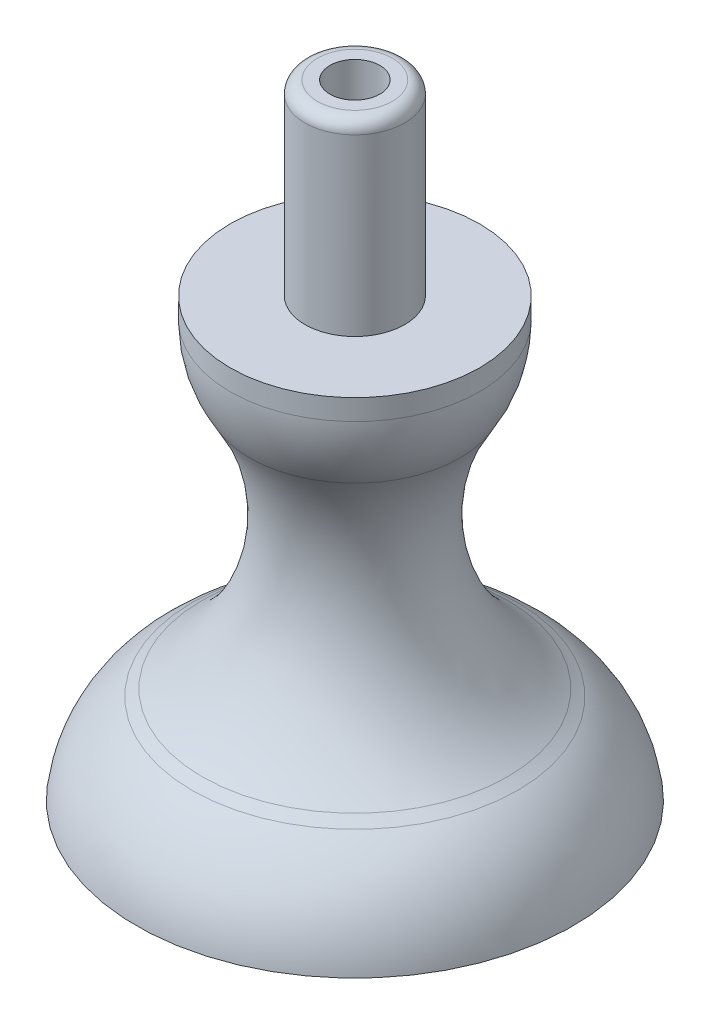
ISO-10303-21;
HEADER;
FILE_DESCRIPTION(('STEP AP214'),'2;1');
FILE_NAME('part.step','',(''),(''),'','','');
FILE_SCHEMA(('AUTOMOTIVE_DESIGN { 1 0 10303 214 1 1 1 1 }'));
ENDSEC;
DATA;
#1=APPLICATION_CONTEXT('core data for automotive mechanical design processes');
#2=APPLICATION_PROTOCOL_DEFINITION('international standard','automotive_design',2000,#1);
#3=PRODUCT_CONTEXT('',#1,'mechanical');
#4=PRODUCT('Part','Part','',(#3));
#5=PRODUCT_RELATED_PRODUCT_CATEGORY('part','',(#4));
#6=PRODUCT_DEFINITION_FORMATION('','',#4);
#7=PRODUCT_DEFINITION_CONTEXT('part definition',#1,'design');
#8=PRODUCT_DEFINITION('design','',#6,#7);
#9=PRODUCT_DEFINITION_SHAPE('','',#8);
#10=(LENGTH_UNIT() NAMED_UNIT(*) SI_UNIT(.MILLI.,.METRE.));
#11=(NAMED_UNIT(*) PLANE_ANGLE_UNIT() SI_UNIT($,.RADIAN.));
#12=(NAMED_UNIT(*) SI_UNIT($,.STERADIAN.) SOLID_ANGLE_UNIT());
#13=UNCERTAINTY_MEASURE_WITH_UNIT(LENGTH_MEASURE(1.E-05),#10,'distance_accuracy_value','');
#14=(GEOMETRIC_REPRESENTATION_CONTEXT(3) GLOBAL_UNCERTAINTY_ASSIGNED_CONTEXT((#13)) GLOBAL_UNIT_ASSIGNED_CONTEXT((#10,
#11,#12)) REPRESENTATION_CONTEXT('',''));
#15=CARTESIAN_POINT('',(0.,0.,0.));
#16=DIRECTION('',(0.,0.,1.));
#17=DIRECTION('',(1.,0.,0.));
#18=AXIS2_PLACEMENT_3D('',#15,#16,#17);
#19=CARTESIAN_POINT('',(0.,0.,0.));
#20=DIRECTION('',(0.,1.,0.));
#21=DIRECTION('',(0.,0.,1.));
#22=AXIS2_PLACEMENT_3D('',#19,#20,#21);
#23=PLANE('',#22);
#24=CARTESIAN_POINT('',(0.,0.,0.));
#25=DIRECTION('',(0.,1.,0.));
#26=DIRECTION('',(0.,0.,1.));
#27=AXIS2_PLACEMENT_3D('',#24,#25,#26);
#28=CIRCLE('',#27,12.5);
#29=CARTESIAN_POINT('',(0.,0.,12.5));
#30=VERTEX_POINT('',#29);
#31=EDGE_CURVE('E213',#30,#30,#28,.T.);
#32=ORIENTED_EDGE('',*,*,#31,.T.);
#33=EDGE_LOOP('',(#32));
#34=FACE_BOUND('',#33,.T.);
#35=CARTESIAN_POINT('',(0.,0.,0.));
#36=DIRECTION('',(0.,-1.,0.));
#37=DIRECTION('',(0.,0.,-1.));
#38=AXIS2_PLACEMENT_3D('',#35,#36,#37);
#39=CIRCLE('',#38,17.5);
#40=CARTESIAN_POINT('',(0.,0.,-17.5));
#41=VERTEX_POINT('',#40);
#42=EDGE_CURVE('E189',#41,#41,#39,.T.);
#43=ORIENTED_EDGE('',*,*,#42,.T.);
#44=EDGE_LOOP('',(#43));
#45=FACE_BOUND('',#44,.T.);
#46=ADVANCED_FACE('F60',(#34,#45),#23,.F.);
#47=CARTESIAN_POINT('',(0.,23.9142803193777,0.));
#48=DIRECTION('',(0.,-1.,0.));
#49=DIRECTION('',(0.,0.,-1.));
#50=AXIS2_PLACEMENT_3D('',#47,#48,#49);
#51=TOROIDAL_SURFACE('',#50,24.,20.);
#52=CARTESIAN_POINT('',(0.,7.1800390678363,0.));
#53=DIRECTION('',(0.,1.,0.));
#54=DIRECTION('',(0.,0.,1.));
#55=AXIS2_PLACEMENT_3D('',#52,#53,#54);
#56=CIRCLE('',#55,13.0471387420816);
#57=CARTESIAN_POINT('',(0.,7.1800390678363,13.0471387420816));
#58=VERTEX_POINT('',#57);
#59=EDGE_CURVE('E201',#58,#58,#56,.T.);
#60=ORIENTED_EDGE('',*,*,#59,.T.);
#61=EDGE_LOOP('',(#60));
#62=FACE_BOUND('',#61,.T.);
#63=CARTESIAN_POINT('',(0.,7.73240678839423,0.));
#64=DIRECTION('',(0.,1.,0.));
#65=DIRECTION('',(0.,0.,1.));
#66=AXIS2_PLACEMENT_3D('',#63,#64,#65);
#67=CIRCLE('',#66,12.2464061229233);
#68=CARTESIAN_POINT('',(0.,7.73240678839423,12.2464061229233));
#69=VERTEX_POINT('',#68);
#70=EDGE_CURVE('E197',#69,#69,#67,.F.);
#71=ORIENTED_EDGE('',*,*,#70,.T.);
#72=EDGE_LOOP('',(#71));
#73=FACE_BOUND('',#72,.T.);
#74=ADVANCED_FACE('F262',(#62,#73),#51,.F.);
#75=CARTESIAN_POINT('',(0.,30.,0.));
#76=DIRECTION('',(0.,1.,0.));
#77=DIRECTION('',(0.,0.,1.));
#78=AXIS2_PLACEMENT_3D('',#75,#76,#77);
#79=CYLINDRICAL_SURFACE('',#78,10.);
#80=CARTESIAN_POINT('',(0.,33.3376255800348,0.));
#81=DIRECTION('',(0.,1.,0.));
#82=DIRECTION('',(0.,0.,1.));
#83=AXIS2_PLACEMENT_3D('',#80,#81,#82);
#84=CIRCLE('',#83,10.);
#85=CARTESIAN_POINT('',(0.,33.3376255800348,10.));
#86=VERTEX_POINT('',#85);
#87=EDGE_CURVE('E209',#86,#86,#84,.T.);
#88=ORIENTED_EDGE('',*,*,#87,.T.);
#89=EDGE_LOOP('',(#88));
#90=FACE_BOUND('',#89,.T.);
#91=CARTESIAN_POINT('',(0.,35.,0.));
#92=DIRECTION('',(0.,-1.,0.));
#93=DIRECTION('',(0.,0.,-1.));
#94=AXIS2_PLACEMENT_3D('',#91,#92,#93);
#95=CIRCLE('',#94,10.);
#96=CARTESIAN_POINT('',(0.,35.,-10.));
#97=VERTEX_POINT('',#96);
#98=EDGE_CURVE('E176',#97,#97,#95,.T.);
#99=ORIENTED_EDGE('',*,*,#98,.T.);
#100=EDGE_LOOP('',(#99));
#101=FACE_BOUND('',#100,.T.);
#102=ADVANCED_FACE('F269',(#90,#101),#79,.T.);
#103=CARTESIAN_POINT('',(0.,35.,0.));
#104=DIRECTION('',(0.,-1.,0.));
#105=DIRECTION('',(0.,0.,-1.));
#106=AXIS2_PLACEMENT_3D('',#103,#104,#105);
#107=PLANE('',#106);
#108=CARTESIAN_POINT('',(0.,35.,0.));
#109=DIRECTION('',(0.,-1.,0.));
#110=DIRECTION('',(0.,0.,-1.));
#111=AXIS2_PLACEMENT_3D('',#108,#109,#110);
#112=CIRCLE('',#111,4.);
#113=CARTESIAN_POINT('',(0.,35.,-4.));
#114=VERTEX_POINT('',#113);
#115=EDGE_CURVE('E193',#114,#114,#112,.T.);
#116=ORIENTED_EDGE('',*,*,#115,.T.);
#117=EDGE_LOOP('',(#116));
#118=FACE_BOUND('',#117,.T.);
#119=ORIENTED_EDGE('',*,*,#98,.F.);
#120=EDGE_LOOP('',(#119));
#121=FACE_BOUND('',#120,.T.);
#122=ADVANCED_FACE('F330',(#118,#121),#107,.F.);
#123=CARTESIAN_POINT('',(0.,50.,0.));
#124=DIRECTION('',(0.,1.,0.));
#125=DIRECTION('',(0.,0.,1.));
#126=AXIS2_PLACEMENT_3D('',#123,#124,#125);
#127=PLANE('',#126);
#128=CARTESIAN_POINT('',(0.,50.,0.));
#129=DIRECTION('',(0.,1.,0.));
#130=DIRECTION('',(0.,0.,1.));
#131=AXIS2_PLACEMENT_3D('',#128,#129,#130);
#132=CIRCLE('',#131,3.);
#133=CARTESIAN_POINT('',(0.,50.,3.));
#134=VERTEX_POINT('',#133);
#135=EDGE_CURVE('E69',#134,#134,#132,.T.);
#136=ORIENTED_EDGE('',*,*,#135,.T.);
#137=EDGE_LOOP('',(#136));
#138=FACE_BOUND('',#137,.T.);
#139=CARTESIAN_POINT('',(0.,50.,0.));
#140=DIRECTION('',(0.,1.,0.));
#141=DIRECTION('',(0.,0.,1.));
#142=AXIS2_PLACEMENT_3D('',#139,#140,#141);
#143=CIRCLE('',#142,2.);
#144=CARTESIAN_POINT('',(0.,50.,2.));
#145=VERTEX_POINT('',#144);
#146=EDGE_CURVE('E225',#145,#145,#143,.T.);
#147=ORIENTED_EDGE('',*,*,#146,.F.);
#148=EDGE_LOOP('',(#147));
#149=FACE_BOUND('',#148,.T.);
#150=ADVANCED_FACE('F248',(#138,#149),#127,.T.);
#151=CARTESIAN_POINT('',(0.,50.,0.));
#152=DIRECTION('',(0.,-1.,0.));
#153=DIRECTION('',(0.,0.,-1.));
#154=AXIS2_PLACEMENT_3D('',#151,#152,#153);
#155=CYLINDRICAL_SURFACE('',#154,4.);
#156=CARTESIAN_POINT('',(0.,49.,0.));
#157=DIRECTION('',(0.,1.,0.));
#158=DIRECTION('',(0.,0.,1.));
#159=AXIS2_PLACEMENT_3D('',#156,#157,#158);
#160=CIRCLE('',#159,4.);
#161=CARTESIAN_POINT('',(0.,49.,4.));
#162=VERTEX_POINT('',#161);
#163=EDGE_CURVE('E12',#162,#162,#160,.F.);
#164=ORIENTED_EDGE('',*,*,#163,.T.);
#165=EDGE_LOOP('',(#164));
#166=FACE_BOUND('',#165,.T.);
#167=ORIENTED_EDGE('',*,*,#115,.F.);
#168=EDGE_LOOP('',(#167));
#169=FACE_BOUND('',#168,.T.);
#170=ADVANCED_FACE('F337',(#166,#169),#155,.T.);
#171=CARTESIAN_POINT('',(0.,19.8688119366319,0.));
#172=DIRECTION('',(0.,-1.,0.));
#173=DIRECTION('',(0.,0.,-1.));
#174=AXIS2_PLACEMENT_3D('',#171,#172,#173);
#175=TOROIDAL_SURFACE('',#174,21.0616015307309,15.);
#176=CARTESIAN_POINT('',(0.,27.9501001226736,0.));
#177=DIRECTION('',(0.,-1.,0.));
#178=DIRECTION('',(0.,0.,-1.));
#179=AXIS2_PLACEMENT_3D('',#176,#177,#178);
#180=CIRCLE('',#179,8.42464061229235);
#181=CARTESIAN_POINT('',(0.,27.9501001226736,-8.42464061229235));
#182=VERTEX_POINT('',#181);
#183=EDGE_CURVE('E205',#182,#182,#180,.T.);
#184=ORIENTED_EDGE('',*,*,#183,.T.);
#185=EDGE_LOOP('',(#184));
#186=FACE_BOUND('',#185,.T.);
#187=ORIENTED_EDGE('',*,*,#70,.F.);
#188=EDGE_LOOP('',(#187));
#189=FACE_BOUND('',#188,.T.);
#190=ADVANCED_FACE('F341',(#186,#189),#175,.F.);
#191=CARTESIAN_POINT('',(0.,-1.18708155793441,0.));
#192=DIRECTION('',(0.,-1.,0.));
#193=DIRECTION('',(0.,0.,-1.));
#194=AXIS2_PLACEMENT_3D('',#191,#192,#193);
#195=DEGENERATE_TOROIDAL_SURFACE('',#194,7.57070811312248,10.,.T.);
#196=ORIENTED_EDGE('',*,*,#59,.F.);
#197=EDGE_LOOP('',(#196));
#198=FACE_BOUND('',#197,.T.);
#199=ORIENTED_EDGE('',*,*,#42,.F.);
#200=EDGE_LOOP('',(#199));
#201=FACE_BOUND('',#200,.T.);
#202=ADVANCED_FACE('F346',(#198,#201),#195,.T.);
#203=CARTESIAN_POINT('',(0.,33.3376255800348,0.));
#204=DIRECTION('',(0.,0.,1.));
#205=DIRECTION('',(1.,0.,0.));
#206=AXIS2_PLACEMENT_3D('',#203,#204,#205);
#207=SPHERICAL_SURFACE('',#206,10.);
#208=CARTESIAN_POINT('',(0.,33.3376255800348,0.));
#209=DIRECTION('',(0.,1.,0.));
#210=DIRECTION('',(0.,0.,1.));
#211=AXIS2_PLACEMENT_3D('',#208,#209,#210);
#212=SPHERICAL_SURFACE('',#211,10.);
#213=ORIENTED_EDGE('',*,*,#87,.F.);
#214=EDGE_LOOP('',(#213));
#215=FACE_BOUND('',#214,.T.);
#216=ORIENTED_EDGE('',*,*,#183,.F.);
#217=EDGE_LOOP('',(#216));
#218=FACE_BOUND('',#217,.T.);
#219=ADVANCED_FACE('F328',(#215,#218),#212,.T.);
#220=CARTESIAN_POINT('',(0.,5.,0.));
#221=DIRECTION('',(0.,-1.,0.));
#222=DIRECTION('',(0.,0.,-1.));
#223=AXIS2_PLACEMENT_3D('',#220,#221,#222);
#224=CYLINDRICAL_SURFACE('',#223,6.25);
#225=CARTESIAN_POINT('',(0.,1.,0.));
#226=DIRECTION('',(0.,1.,0.));
#227=DIRECTION('',(0.,0.,1.));
#228=AXIS2_PLACEMENT_3D('',#225,#226,#227);
#229=CIRCLE('',#228,6.25);
#230=CARTESIAN_POINT('',(0.,1.,6.25));
#231=VERTEX_POINT('',#230);
#232=EDGE_CURVE('E233',#231,#231,#229,.T.);
#233=ORIENTED_EDGE('',*,*,#232,.T.);
#234=EDGE_LOOP('',(#233));
#235=FACE_BOUND('',#234,.T.);
#236=CARTESIAN_POINT('',(0.,4.,0.));
#237=DIRECTION('',(0.,-1.,0.));
#238=DIRECTION('',(0.,0.,-1.));
#239=AXIS2_PLACEMENT_3D('',#236,#237,#238);
#240=CIRCLE('',#239,6.25);
#241=CARTESIAN_POINT('',(0.,4.,-6.25));
#242=VERTEX_POINT('',#241);
#243=EDGE_CURVE('E229',#242,#242,#240,.T.);
#244=ORIENTED_EDGE('',*,*,#243,.T.);
#245=EDGE_LOOP('',(#244));
#246=FACE_BOUND('',#245,.T.);
#247=ADVANCED_FACE('F285',(#235,#246),#224,.T.);
#248=CARTESIAN_POINT('',(0.,5.,0.));
#249=DIRECTION('',(0.,-1.,0.));
#250=DIRECTION('',(0.,0.,-1.));
#251=AXIS2_PLACEMENT_3D('',#248,#249,#250);
#252=PLANE('',#251);
#253=CARTESIAN_POINT('',(0.,5.,0.));
#254=DIRECTION('',(0.,-1.,0.));
#255=DIRECTION('',(0.,0.,-1.));
#256=AXIS2_PLACEMENT_3D('',#253,#254,#255);
#257=CIRCLE('',#256,7.25);
#258=CARTESIAN_POINT('',(0.,5.,-7.25));
#259=VERTEX_POINT('',#258);
#260=EDGE_CURVE('E237',#259,#259,#257,.F.);
#261=ORIENTED_EDGE('',*,*,#260,.T.);
#262=EDGE_LOOP('',(#261));
#263=FACE_BOUND('',#262,.T.);
#264=CARTESIAN_POINT('',(0.,5.,0.));
#265=DIRECTION('',(0.,-1.,0.));
#266=DIRECTION('',(0.,0.,-1.));
#267=AXIS2_PLACEMENT_3D('',#264,#265,#266);
#268=CIRCLE('',#267,7.5);
#269=CARTESIAN_POINT('',(0.,5.,-7.5));
#270=VERTEX_POINT('',#269);
#271=EDGE_CURVE('E217',#270,#270,#268,.T.);
#272=ORIENTED_EDGE('',*,*,#271,.T.);
#273=EDGE_LOOP('',(#272));
#274=FACE_BOUND('',#273,.T.);
#275=ADVANCED_FACE('F277',(#263,#274),#252,.T.);
#276=CARTESIAN_POINT('',(0.,0.,0.));
#277=DIRECTION('',(0.,1.,0.));
#278=DIRECTION('',(0.,0.,1.));
#279=AXIS2_PLACEMENT_3D('',#276,#277,#278);
#280=CIRCLE('',#279,5.25);
#281=CARTESIAN_POINT('',(0.,0.,5.25));
#282=VERTEX_POINT('',#281);
#283=EDGE_CURVE('E221',#282,#282,#280,.F.);
#284=ORIENTED_EDGE('',*,*,#283,.T.);
#285=EDGE_LOOP('',(#284));
#286=FACE_BOUND('',#285,.T.);
#287=DIRECTION('',(-0.5,0.,-0.866025403784439));
#288=VECTOR('',#287,1.);
#289=CARTESIAN_POINT('',(-3.46410161513776,0.,2.));
#290=LINE('',#289,#288);
#291=CARTESIAN_POINT('',(-2.3094010767585,0.,4.));
#292=VERTEX_POINT('',#291);
#293=CARTESIAN_POINT('',(-4.61880215351701,0.,0.));
#294=VERTEX_POINT('',#293);
#295=EDGE_CURVE('E156',#292,#294,#290,.T.);
#296=ORIENTED_EDGE('',*,*,#295,.F.);
#297=DIRECTION('',(-1.,0.,0.));
#298=VECTOR('',#297,1.);
#299=CARTESIAN_POINT('',(0.,0.,4.));
#300=LINE('',#299,#298);
#301=CARTESIAN_POINT('',(2.3094010767585,0.,4.));
#302=VERTEX_POINT('',#301);
#303=EDGE_CURVE('E76',#302,#292,#300,.T.);
#304=ORIENTED_EDGE('',*,*,#303,.F.);
#305=DIRECTION('',(-0.5,0.,0.866025403784439));
#306=VECTOR('',#305,1.);
#307=CARTESIAN_POINT('',(3.46410161513776,0.,2.));
#308=LINE('',#307,#306);
#309=CARTESIAN_POINT('',(4.61880215351701,0.,0.));
#310=VERTEX_POINT('',#309);
#311=EDGE_CURVE('E170',#310,#302,#308,.T.);
#312=ORIENTED_EDGE('',*,*,#311,.F.);
#313=DIRECTION('',(0.5,0.,0.866025403784439));
#314=VECTOR('',#313,1.);
#315=CARTESIAN_POINT('',(3.46410161513776,0.,-2.));
#316=LINE('',#315,#314);
#317=CARTESIAN_POINT('',(2.3094010767585,0.,-4.));
#318=VERTEX_POINT('',#317);
#319=EDGE_CURVE('E167',#318,#310,#316,.T.);
#320=ORIENTED_EDGE('',*,*,#319,.F.);
#321=DIRECTION('',(1.,0.,0.));
#322=VECTOR('',#321,1.);
#323=CARTESIAN_POINT('',(0.,0.,-4.));
#324=LINE('',#323,#322);
#325=CARTESIAN_POINT('',(-2.3094010767585,0.,-4.));
#326=VERTEX_POINT('',#325);
#327=EDGE_CURVE('E124',#326,#318,#324,.T.);
#328=ORIENTED_EDGE('',*,*,#327,.F.);
#329=DIRECTION('',(0.5,0.,-0.866025403784439));
#330=VECTOR('',#329,1.);
#331=CARTESIAN_POINT('',(-3.46410161513775,0.,-2.));
#332=LINE('',#331,#330);
#333=EDGE_CURVE('E161',#294,#326,#332,.T.);
#334=ORIENTED_EDGE('',*,*,#333,.F.);
#335=EDGE_LOOP('',(#296,#304,#312,#320,#328,#334));
#336=FACE_BOUND('',#335,.T.);
#337=ADVANCED_FACE('F265',(#286,#336),#23,.F.);
#338=CARTESIAN_POINT('',(0.,5.,4.));
#339=DIRECTION('',(0.,0.,1.));
#340=DIRECTION('',(1.,0.,0.));
#341=AXIS2_PLACEMENT_3D('',#338,#339,#340);
#342=PLANE('',#341);
#343=ORIENTED_EDGE('',*,*,#303,.T.);
#344=DIRECTION('',(0.,-1.,0.));
#345=VECTOR('',#344,1.);
#346=CARTESIAN_POINT('',(-2.3094010767585,5.,4.));
#347=LINE('',#346,#345);
#348=CARTESIAN_POINT('',(-2.3094010767585,5.,4.));
#349=VERTEX_POINT('',#348);
#350=EDGE_CURVE('E106',#349,#292,#347,.T.);
#351=ORIENTED_EDGE('',*,*,#350,.F.);
#352=DIRECTION('',(-1.,0.,0.));
#353=VECTOR('',#352,1.);
#354=CARTESIAN_POINT('',(0.,5.,4.));
#355=LINE('',#354,#353);
#356=CARTESIAN_POINT('',(2.3094010767585,5.,4.));
#357=VERTEX_POINT('',#356);
#358=EDGE_CURVE('E173',#357,#349,#355,.T.);
#359=ORIENTED_EDGE('',*,*,#358,.F.);
#360=DIRECTION('',(0.,-1.,0.));
#361=VECTOR('',#360,1.);
#362=CARTESIAN_POINT('',(2.3094010767585,5.,4.));
#363=LINE('',#362,#361);
#364=EDGE_CURVE('E84',#357,#302,#363,.T.);
#365=ORIENTED_EDGE('',*,*,#364,.T.);
#366=EDGE_LOOP('',(#343,#351,#359,#365));
#367=FACE_BOUND('',#366,.T.);
#368=ADVANCED_FACE('F276',(#367),#342,.F.);
#369=CARTESIAN_POINT('',(3.46410161513776,5.,2.));
#370=DIRECTION('',(0.866025403784439,0.,0.5));
#371=DIRECTION('',(0.5,0.,-0.866025403784439));
#372=AXIS2_PLACEMENT_3D('',#369,#370,#371);
#373=PLANE('',#372);
#374=ORIENTED_EDGE('',*,*,#311,.T.);
#375=ORIENTED_EDGE('',*,*,#364,.F.);
#376=DIRECTION('',(-0.5,0.,0.866025403784439));
#377=VECTOR('',#376,1.);
#378=CARTESIAN_POINT('',(3.46410161513776,5.,2.));
#379=LINE('',#378,#377);
#380=CARTESIAN_POINT('',(4.61880215351701,5.,0.));
#381=VERTEX_POINT('',#380);
#382=EDGE_CURVE('E138',#381,#357,#379,.T.);
#383=ORIENTED_EDGE('',*,*,#382,.F.);
#384=DIRECTION('',(0.,-1.,0.));
#385=VECTOR('',#384,1.);
#386=CARTESIAN_POINT('',(4.61880215351701,5.,0.));
#387=LINE('',#386,#385);
#388=EDGE_CURVE('E129',#381,#310,#387,.T.);
#389=ORIENTED_EDGE('',*,*,#388,.T.);
#390=EDGE_LOOP('',(#374,#375,#383,#389));
#391=FACE_BOUND('',#390,.T.);
#392=ADVANCED_FACE('F283',(#391),#373,.F.);
#393=CARTESIAN_POINT('',(3.46410161513776,5.,-2.));
#394=DIRECTION('',(0.866025403784439,0.,-0.5));
#395=DIRECTION('',(-0.5,0.,-0.866025403784439));
#396=AXIS2_PLACEMENT_3D('',#393,#394,#395);
#397=PLANE('',#396);
#398=ORIENTED_EDGE('',*,*,#319,.T.);
#399=ORIENTED_EDGE('',*,*,#388,.F.);
#400=DIRECTION('',(0.5,0.,0.866025403784439));
#401=VECTOR('',#400,1.);
#402=CARTESIAN_POINT('',(3.46410161513776,5.,-2.));
#403=LINE('',#402,#401);
#404=CARTESIAN_POINT('',(2.3094010767585,5.,-4.));
#405=VERTEX_POINT('',#404);
#406=EDGE_CURVE('E133',#405,#381,#403,.T.);
#407=ORIENTED_EDGE('',*,*,#406,.F.);
#408=DIRECTION('',(0.,-1.,0.));
#409=VECTOR('',#408,1.);
#410=CARTESIAN_POINT('',(2.3094010767585,5.,-4.));
#411=LINE('',#410,#409);
#412=EDGE_CURVE('E117',#405,#318,#411,.T.);
#413=ORIENTED_EDGE('',*,*,#412,.T.);
#414=EDGE_LOOP('',(#398,#399,#407,#413));
#415=FACE_BOUND('',#414,.T.);
#416=ADVANCED_FACE('F134',(#415),#397,.F.);
#417=CARTESIAN_POINT('',(0.,5.,-4.));
#418=DIRECTION('',(0.,0.,-1.));
#419=DIRECTION('',(-1.,0.,0.));
#420=AXIS2_PLACEMENT_3D('',#417,#418,#419);
#421=PLANE('',#420);
#422=ORIENTED_EDGE('',*,*,#327,.T.);
#423=ORIENTED_EDGE('',*,*,#412,.F.);
#424=DIRECTION('',(1.,0.,0.));
#425=VECTOR('',#424,1.);
#426=CARTESIAN_POINT('',(0.,5.,-4.));
#427=LINE('',#426,#425);
#428=CARTESIAN_POINT('',(-2.3094010767585,5.,-4.));
#429=VERTEX_POINT('',#428);
#430=EDGE_CURVE('E121',#429,#405,#427,.T.);
#431=ORIENTED_EDGE('',*,*,#430,.F.);
#432=DIRECTION('',(0.,-1.,0.));
#433=VECTOR('',#432,1.);
#434=CARTESIAN_POINT('',(-2.3094010767585,5.,-4.));
#435=LINE('',#434,#433);
#436=EDGE_CURVE('E130',#429,#326,#435,.T.);
#437=ORIENTED_EDGE('',*,*,#436,.T.);
#438=EDGE_LOOP('',(#422,#423,#431,#437));
#439=FACE_BOUND('',#438,.T.);
#440=ADVANCED_FACE('F119',(#439),#421,.F.);
#441=CARTESIAN_POINT('',(-3.46410161513775,5.,-2.));
#442=DIRECTION('',(-0.866025403784439,0.,-0.5));
#443=DIRECTION('',(-0.5,0.,0.866025403784439));
#444=AXIS2_PLACEMENT_3D('',#441,#442,#443);
#445=PLANE('',#444);
#446=ORIENTED_EDGE('',*,*,#333,.T.);
#447=ORIENTED_EDGE('',*,*,#436,.F.);
#448=DIRECTION('',(0.5,0.,-0.866025403784439));
#449=VECTOR('',#448,1.);
#450=CARTESIAN_POINT('',(-3.46410161513775,5.,-2.));
#451=LINE('',#450,#449);
#452=CARTESIAN_POINT('',(-4.61880215351701,5.,0.));
#453=VERTEX_POINT('',#452);
#454=EDGE_CURVE('E144',#453,#429,#451,.T.);
#455=ORIENTED_EDGE('',*,*,#454,.F.);
#456=DIRECTION('',(0.,-1.,0.));
#457=VECTOR('',#456,1.);
#458=CARTESIAN_POINT('',(-4.61880215351701,5.,0.));
#459=LINE('',#458,#457);
#460=EDGE_CURVE('E181',#453,#294,#459,.T.);
#461=ORIENTED_EDGE('',*,*,#460,.T.);
#462=EDGE_LOOP('',(#446,#447,#455,#461));
#463=FACE_BOUND('',#462,.T.);
#464=ADVANCED_FACE('F314',(#463),#445,.F.);
#465=CARTESIAN_POINT('',(-3.46410161513776,5.,2.));
#466=DIRECTION('',(-0.866025403784439,0.,0.5));
#467=DIRECTION('',(0.5,0.,0.866025403784439));
#468=AXIS2_PLACEMENT_3D('',#465,#466,#467);
#469=PLANE('',#468);
#470=ORIENTED_EDGE('',*,*,#295,.T.);
#471=ORIENTED_EDGE('',*,*,#460,.F.);
#472=DIRECTION('',(-0.5,0.,-0.866025403784439));
#473=VECTOR('',#472,1.);
#474=CARTESIAN_POINT('',(-3.46410161513776,5.,2.));
#475=LINE('',#474,#473);
#476=EDGE_CURVE('E148',#349,#453,#475,.T.);
#477=ORIENTED_EDGE('',*,*,#476,.F.);
#478=ORIENTED_EDGE('',*,*,#350,.T.);
#479=EDGE_LOOP('',(#470,#471,#477,#478));
#480=FACE_BOUND('',#479,.T.);
#481=ADVANCED_FACE('F294',(#480),#469,.F.);
#482=CARTESIAN_POINT('',(0.,5.,0.));
#483=DIRECTION('',(0.,-1.,0.));
#484=DIRECTION('',(0.,0.,-1.));
#485=AXIS2_PLACEMENT_3D('',#482,#483,#484);
#486=PLANE('',#485);
#487=CARTESIAN_POINT('',(0.,5.,0.));
#488=DIRECTION('',(0.,-1.,0.));
#489=DIRECTION('',(0.,0.,-1.));
#490=AXIS2_PLACEMENT_3D('',#487,#488,#489);
#491=CIRCLE('',#490,2.);
#492=CARTESIAN_POINT('',(0.,5.,-2.));
#493=VERTEX_POINT('',#492);
#494=EDGE_CURVE('E243',#493,#493,#491,.T.);
#495=ORIENTED_EDGE('',*,*,#494,.F.);
#496=EDGE_LOOP('',(#495));
#497=FACE_BOUND('',#496,.T.);
#498=ORIENTED_EDGE('',*,*,#358,.T.);
#499=ORIENTED_EDGE('',*,*,#476,.T.);
#500=ORIENTED_EDGE('',*,*,#454,.T.);
#501=ORIENTED_EDGE('',*,*,#430,.T.);
#502=ORIENTED_EDGE('',*,*,#406,.T.);
#503=ORIENTED_EDGE('',*,*,#382,.T.);
#504=EDGE_LOOP('',(#498,#499,#500,#501,#502,#503));
#505=FACE_BOUND('',#504,.T.);
#506=ADVANCED_FACE('F141',(#497,#505),#486,.T.);
#507=CARTESIAN_POINT('',(0.,2.5,0.));
#508=DIRECTION('',(0.,-1.,0.));
#509=DIRECTION('',(0.,0.,-1.));
#510=AXIS2_PLACEMENT_3D('',#507,#508,#509);
#511=TOROIDAL_SURFACE('',#510,7.5,2.5);
#512=ORIENTED_EDGE('',*,*,#271,.F.);
#513=EDGE_LOOP('',(#512));
#514=FACE_BOUND('',#513,.T.);
#515=CARTESIAN_POINT('',(0.,2.5,0.));
#516=DIRECTION('',(0.,-1.,0.));
#517=DIRECTION('',(0.,0.,-1.));
#518=AXIS2_PLACEMENT_3D('',#515,#516,#517);
#519=CIRCLE('',#518,10.);
#520=CARTESIAN_POINT('',(0.,2.5,-10.));
#521=VERTEX_POINT('',#520);
#522=EDGE_CURVE('E157',#521,#521,#519,.F.);
#523=ORIENTED_EDGE('',*,*,#522,.F.);
#524=EDGE_LOOP('',(#523));
#525=FACE_BOUND('',#524,.T.);
#526=ADVANCED_FACE('F305',(#514,#525),#511,.F.);
#527=CARTESIAN_POINT('',(0.,2.5,0.));
#528=DIRECTION('',(0.,1.,0.));
#529=DIRECTION('',(0.,0.,1.));
#530=AXIS2_PLACEMENT_3D('',#527,#528,#529);
#531=TOROIDAL_SURFACE('',#530,12.5,2.5);
#532=ORIENTED_EDGE('',*,*,#31,.F.);
#533=EDGE_LOOP('',(#532));
#534=FACE_BOUND('',#533,.T.);
#535=ORIENTED_EDGE('',*,*,#522,.T.);
#536=EDGE_LOOP('',(#535));
#537=FACE_BOUND('',#536,.T.);
#538=ADVANCED_FACE('F311',(#534,#537),#531,.T.);
#539=CARTESIAN_POINT('',(0.,1.,0.));
#540=DIRECTION('',(0.,1.,0.));
#541=DIRECTION('',(0.,0.,1.));
#542=AXIS2_PLACEMENT_3D('',#539,#540,#541);
#543=TOROIDAL_SURFACE('',#542,5.25,1.);
#544=ORIENTED_EDGE('',*,*,#232,.F.);
#545=EDGE_LOOP('',(#544));
#546=FACE_BOUND('',#545,.T.);
#547=ORIENTED_EDGE('',*,*,#283,.F.);
#548=EDGE_LOOP('',(#547));
#549=FACE_BOUND('',#548,.T.);
#550=ADVANCED_FACE('F358',(#546,#549),#543,.T.);
#551=CARTESIAN_POINT('',(0.,4.,0.));
#552=DIRECTION('',(0.,-1.,0.));
#553=DIRECTION('',(0.,0.,-1.));
#554=AXIS2_PLACEMENT_3D('',#551,#552,#553);
#555=TOROIDAL_SURFACE('',#554,7.25,1.);
#556=ORIENTED_EDGE('',*,*,#260,.F.);
#557=EDGE_LOOP('',(#556));
#558=FACE_BOUND('',#557,.T.);
#559=ORIENTED_EDGE('',*,*,#243,.F.);
#560=EDGE_LOOP('',(#559));
#561=FACE_BOUND('',#560,.T.);
#562=ADVANCED_FACE('F257',(#558,#561),#555,.F.);
#563=CARTESIAN_POINT('',(0.,75.,0.));
#564=DIRECTION('',(0.,-1.,0.));
#565=DIRECTION('',(0.,0.,-1.));
#566=AXIS2_PLACEMENT_3D('',#563,#564,#565);
#567=CYLINDRICAL_SURFACE('',#566,2.);
#568=ORIENTED_EDGE('',*,*,#146,.T.);
#569=EDGE_LOOP('',(#568));
#570=FACE_BOUND('',#569,.T.);
#571=ORIENTED_EDGE('',*,*,#494,.T.);
#572=EDGE_LOOP('',(#571));
#573=FACE_BOUND('',#572,.T.);
#574=ADVANCED_FACE('F252',(#570,#573),#567,.F.);
#575=CARTESIAN_POINT('',(0.,49.,0.));
#576=DIRECTION('',(0.,1.,0.));
#577=DIRECTION('',(0.,0.,1.));
#578=AXIS2_PLACEMENT_3D('',#575,#576,#577);
#579=TOROIDAL_SURFACE('',#578,3.,1.);
#580=ORIENTED_EDGE('',*,*,#163,.F.);
#581=EDGE_LOOP('',(#580));
#582=FACE_BOUND('',#581,.T.);
#583=ORIENTED_EDGE('',*,*,#135,.F.);
#584=EDGE_LOOP('',(#583));
#585=FACE_BOUND('',#584,.T.);
#586=ADVANCED_FACE('F62',(#582,#585),#579,.T.);
#587=CLOSED_SHELL('',(#46,#74,#102,#122,#150,#170,#190,#202,#219,#247,#275,#337,#368,#392,#416,
#440,#464,#481,#506,#526,#538,#550,#562,#574,#586));
#588=MANIFOLD_SOLID_BREP('B2',#587);
#589=ADVANCED_BREP_SHAPE_REPRESENTATION('',(#18,#588),#14);
#590=SHAPE_DEFINITION_REPRESENTATION(#9,#589);
ENDSEC;
END-ISO-10303-21;
